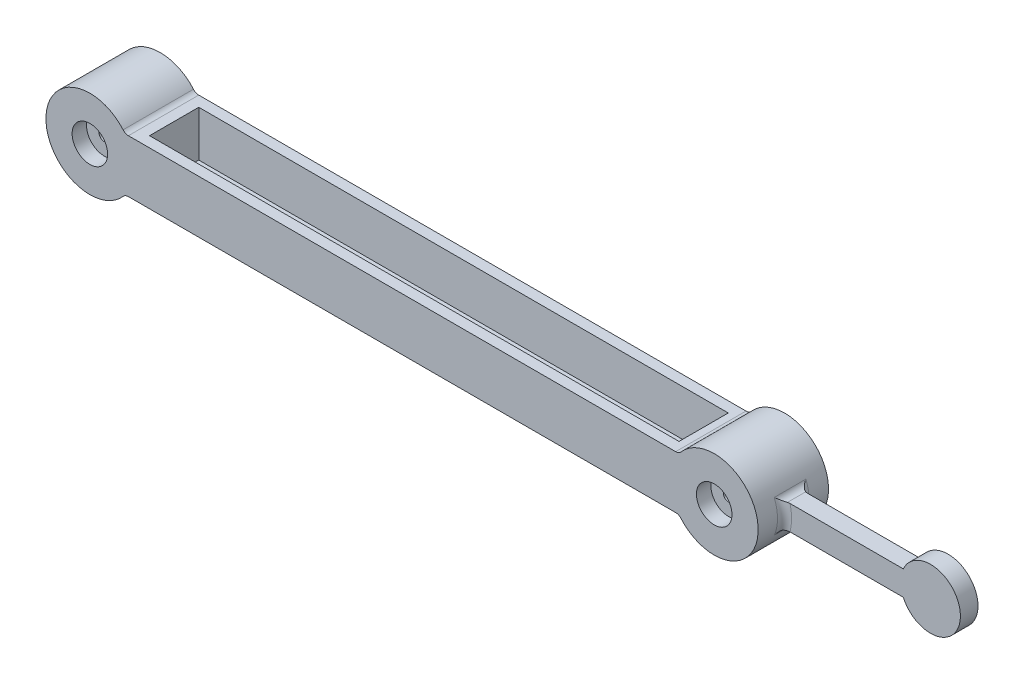
ISO-10303-21;
HEADER;
FILE_DESCRIPTION(('STEP AP214'),'2;1');
FILE_NAME('part.step','',(''),(''),'','','');
FILE_SCHEMA(('AUTOMOTIVE_DESIGN { 1 0 10303 214 1 1 1 1 }'));
ENDSEC;
DATA;
#1=APPLICATION_CONTEXT('core data for automotive mechanical design processes');
#2=APPLICATION_PROTOCOL_DEFINITION('international standard','automotive_design',2000,#1);
#3=PRODUCT_CONTEXT('',#1,'mechanical');
#4=PRODUCT('Part','Part','',(#3));
#5=PRODUCT_RELATED_PRODUCT_CATEGORY('part','',(#4));
#6=PRODUCT_DEFINITION_FORMATION('','',#4);
#7=PRODUCT_DEFINITION_CONTEXT('part definition',#1,'design');
#8=PRODUCT_DEFINITION('design','',#6,#7);
#9=PRODUCT_DEFINITION_SHAPE('','',#8);
#10=(LENGTH_UNIT() NAMED_UNIT(*) SI_UNIT(.MILLI.,.METRE.));
#11=(NAMED_UNIT(*) PLANE_ANGLE_UNIT() SI_UNIT($,.RADIAN.));
#12=(NAMED_UNIT(*) SI_UNIT($,.STERADIAN.) SOLID_ANGLE_UNIT());
#13=UNCERTAINTY_MEASURE_WITH_UNIT(LENGTH_MEASURE(1.E-05),#10,'distance_accuracy_value','');
#14=(GEOMETRIC_REPRESENTATION_CONTEXT(3) GLOBAL_UNCERTAINTY_ASSIGNED_CONTEXT((#13)) GLOBAL_UNIT_ASSIGNED_CONTEXT((#10,
#11,#12)) REPRESENTATION_CONTEXT('',''));
#15=CARTESIAN_POINT('',(0.,0.,0.));
#16=DIRECTION('',(0.,0.,1.));
#17=DIRECTION('',(1.,0.,0.));
#18=AXIS2_PLACEMENT_3D('',#15,#16,#17);
#19=CARTESIAN_POINT('',(200.,-20.001,12.5));
#20=DIRECTION('',(0.,0.,1.));
#21=DIRECTION('',(1.,0.,0.));
#22=AXIS2_PLACEMENT_3D('',#19,#20,#21);
#23=PLANE('',#22);
#24=CARTESIAN_POINT('',(241.5,-7.49999999999998,12.5));
#25=DIRECTION('',(0.,0.,1.));
#26=DIRECTION('',(1.,0.,0.));
#27=AXIS2_PLACEMENT_3D('',#24,#25,#26);
#28=CIRCLE('',#27,8.50000000000001);
#29=CARTESIAN_POINT('',(233.754033307585,-3.99999999999998,12.5));
#30=VERTEX_POINT('',#29);
#31=CARTESIAN_POINT('',(233.754033307585,-11.,12.5));
#32=VERTEX_POINT('',#31);
#33=EDGE_CURVE('E259',#30,#32,#28,.F.);
#34=ORIENTED_EDGE('',*,*,#33,.F.);
#35=DIRECTION('',(1.,0.,0.));
#36=VECTOR('',#35,1.);
#37=CARTESIAN_POINT('',(200.,-3.99999999999998,12.5));
#38=LINE('',#37,#36);
#39=CARTESIAN_POINT('',(201.57124727947,-3.99999999999998,12.5));
#40=VERTEX_POINT('',#39);
#41=EDGE_CURVE('E281',#40,#30,#38,.T.);
#42=ORIENTED_EDGE('',*,*,#41,.F.);
#43=CARTESIAN_POINT('',(187.5,-7.5,12.5));
#44=DIRECTION('',(0.,0.,1.));
#45=DIRECTION('',(1.,0.,0.));
#46=AXIS2_PLACEMENT_3D('',#43,#44,#45);
#47=CIRCLE('',#46,14.5);
#48=CARTESIAN_POINT('',(201.57124727947,-11.,12.5));
#49=VERTEX_POINT('',#48);
#50=EDGE_CURVE('E363',#40,#49,#47,.F.);
#51=ORIENTED_EDGE('',*,*,#50,.T.);
#52=DIRECTION('',(-1.,0.,0.));
#53=VECTOR('',#52,1.);
#54=CARTESIAN_POINT('',(250.,-11.,12.5));
#55=LINE('',#54,#53);
#56=EDGE_CURVE('E278',#32,#49,#55,.T.);
#57=ORIENTED_EDGE('',*,*,#56,.F.);
#58=EDGE_LOOP('',(#34,#42,#51,#57));
#59=FACE_BOUND('',#58,.T.);
#60=ADVANCED_FACE('F58',(#59),#23,.T.);
#61=CARTESIAN_POINT('',(200.,-20.001,7.50000000000001));
#62=DIRECTION('',(0.,0.,-1.));
#63=DIRECTION('',(-1.,0.,0.));
#64=AXIS2_PLACEMENT_3D('',#61,#62,#63);
#65=PLANE('',#64);
#66=DIRECTION('',(-1.,0.,0.));
#67=VECTOR('',#66,1.);
#68=CARTESIAN_POINT('',(200.,-3.99999999999998,7.50000000000001));
#69=LINE('',#68,#67);
#70=CARTESIAN_POINT('',(233.754033307585,-3.99999999999998,7.50000000000001));
#71=VERTEX_POINT('',#70);
#72=CARTESIAN_POINT('',(201.57124727947,-3.99999999999998,7.50000000000001));
#73=VERTEX_POINT('',#72);
#74=EDGE_CURVE('E285',#71,#73,#69,.T.);
#75=ORIENTED_EDGE('',*,*,#74,.F.);
#76=CARTESIAN_POINT('',(241.5,-7.49999999999998,7.50000000000001));
#77=DIRECTION('',(0.,0.,-1.));
#78=DIRECTION('',(-1.,0.,0.));
#79=AXIS2_PLACEMENT_3D('',#76,#77,#78);
#80=CIRCLE('',#79,8.50000000000001);
#81=CARTESIAN_POINT('',(233.754033307585,-11.,7.50000000000001));
#82=VERTEX_POINT('',#81);
#83=EDGE_CURVE('E250',#71,#82,#80,.T.);
#84=ORIENTED_EDGE('',*,*,#83,.T.);
#85=DIRECTION('',(-1.,0.,0.));
#86=VECTOR('',#85,1.);
#87=CARTESIAN_POINT('',(250.,-11.,7.5));
#88=LINE('',#87,#86);
#89=CARTESIAN_POINT('',(201.57124727947,-11.,7.5));
#90=VERTEX_POINT('',#89);
#91=EDGE_CURVE('E274',#82,#90,#88,.T.);
#92=ORIENTED_EDGE('',*,*,#91,.T.);
#93=CARTESIAN_POINT('',(187.5,-7.5,7.50000000000001));
#94=DIRECTION('',(0.,0.,-1.));
#95=DIRECTION('',(-1.,0.,0.));
#96=AXIS2_PLACEMENT_3D('',#93,#94,#95);
#97=CIRCLE('',#96,14.5);
#98=EDGE_CURVE('E343',#90,#73,#97,.F.);
#99=ORIENTED_EDGE('',*,*,#98,.T.);
#100=EDGE_LOOP('',(#75,#84,#92,#99));
#101=FACE_BOUND('',#100,.T.);
#102=ADVANCED_FACE('F514',(#101),#65,.T.);
#103=CARTESIAN_POINT('',(0.,0.,20.));
#104=DIRECTION('',(0.,0.,1.));
#105=DIRECTION('',(1.,0.,0.));
#106=AXIS2_PLACEMENT_3D('',#103,#104,#105);
#107=PLANE('',#106);
#108=CARTESIAN_POINT('',(187.5,-7.5,20.));
#109=DIRECTION('',(0.,0.,1.));
#110=DIRECTION('',(1.,0.,0.));
#111=AXIS2_PLACEMENT_3D('',#108,#109,#110);
#112=CIRCLE('',#111,5.04999999999999);
#113=CARTESIAN_POINT('',(192.55,-7.5,20.));
#114=VERTEX_POINT('',#113);
#115=EDGE_CURVE('E465',#114,#114,#112,.T.);
#116=ORIENTED_EDGE('',*,*,#115,.F.);
#117=EDGE_LOOP('',(#116));
#118=FACE_BOUND('',#117,.T.);
#119=CARTESIAN_POINT('',(10.,-7.5,20.));
#120=DIRECTION('',(0.,0.,1.));
#121=DIRECTION('',(1.,0.,0.));
#122=AXIS2_PLACEMENT_3D('',#119,#120,#121);
#123=CIRCLE('',#122,5.05);
#124=CARTESIAN_POINT('',(15.05,-7.5,20.));
#125=VERTEX_POINT('',#124);
#126=EDGE_CURVE('E231',#125,#125,#123,.T.);
#127=ORIENTED_EDGE('',*,*,#126,.F.);
#128=EDGE_LOOP('',(#127));
#129=FACE_BOUND('',#128,.T.);
#130=DIRECTION('',(1.,0.,0.));
#131=VECTOR('',#130,1.);
#132=CARTESIAN_POINT('',(0.,-15.,20.));
#133=LINE('',#132,#131);
#134=CARTESIAN_POINT('',(20.9544511501033,-15.,20.));
#135=VERTEX_POINT('',#134);
#136=CARTESIAN_POINT('',(176.545548849897,-15.,20.));
#137=VERTEX_POINT('',#136);
#138=EDGE_CURVE('E303',#135,#137,#133,.T.);
#139=ORIENTED_EDGE('',*,*,#138,.T.);
#140=CARTESIAN_POINT('',(176.545548849897,-17.,20.));
#141=DIRECTION('',(0.,0.,1.));
#142=DIRECTION('',(1.,0.,0.));
#143=AXIS2_PLACEMENT_3D('',#140,#141,#142);
#144=CIRCLE('',#143,2.);
#145=CARTESIAN_POINT('',(178.056507629221,-15.6896551724138,20.));
#146=VERTEX_POINT('',#145);
#147=EDGE_CURVE('E68',#137,#146,#144,.F.);
#148=ORIENTED_EDGE('',*,*,#147,.T.);
#149=CARTESIAN_POINT('',(187.5,-7.5,20.));
#150=DIRECTION('',(0.,0.,1.));
#151=DIRECTION('',(1.,0.,0.));
#152=AXIS2_PLACEMENT_3D('',#149,#150,#151);
#153=CIRCLE('',#152,12.5);
#154=CARTESIAN_POINT('',(178.056507629221,0.689655172413798,20.));
#155=VERTEX_POINT('',#154);
#156=EDGE_CURVE('E288',#146,#155,#153,.T.);
#157=ORIENTED_EDGE('',*,*,#156,.T.);
#158=CARTESIAN_POINT('',(176.545548849897,2.,20.));
#159=DIRECTION('',(0.,0.,1.));
#160=DIRECTION('',(1.,0.,0.));
#161=AXIS2_PLACEMENT_3D('',#158,#159,#160);
#162=CIRCLE('',#161,2.);
#163=CARTESIAN_POINT('',(176.545548849897,0.,20.));
#164=VERTEX_POINT('',#163);
#165=EDGE_CURVE('E449',#155,#164,#162,.F.);
#166=ORIENTED_EDGE('',*,*,#165,.T.);
#167=DIRECTION('',(1.,0.,0.));
#168=VECTOR('',#167,1.);
#169=CARTESIAN_POINT('',(0.,0.,20.));
#170=LINE('',#169,#168);
#171=CARTESIAN_POINT('',(20.9544511501033,0.,20.));
#172=VERTEX_POINT('',#171);
#173=EDGE_CURVE('E306',#172,#164,#170,.T.);
#174=ORIENTED_EDGE('',*,*,#173,.F.);
#175=CARTESIAN_POINT('',(20.9544511501033,2.,20.));
#176=DIRECTION('',(0.,0.,1.));
#177=DIRECTION('',(1.,0.,0.));
#178=AXIS2_PLACEMENT_3D('',#175,#176,#177);
#179=CIRCLE('',#178,2.);
#180=CARTESIAN_POINT('',(19.4434923707787,0.689655172413794,20.));
#181=VERTEX_POINT('',#180);
#182=EDGE_CURVE('E340',#172,#181,#179,.F.);
#183=ORIENTED_EDGE('',*,*,#182,.T.);
#184=CARTESIAN_POINT('',(10.,-7.5,20.));
#185=DIRECTION('',(0.,0.,-1.));
#186=DIRECTION('',(-1.,0.,0.));
#187=AXIS2_PLACEMENT_3D('',#184,#185,#186);
#188=CIRCLE('',#187,12.5);
#189=CARTESIAN_POINT('',(19.4434923707787,-15.6896551724138,20.));
#190=VERTEX_POINT('',#189);
#191=EDGE_CURVE('E295',#190,#181,#188,.T.);
#192=ORIENTED_EDGE('',*,*,#191,.F.);
#193=CARTESIAN_POINT('',(20.9544511501033,-17.,20.));
#194=DIRECTION('',(0.,0.,1.));
#195=DIRECTION('',(1.,0.,0.));
#196=AXIS2_PLACEMENT_3D('',#193,#194,#195);
#197=CIRCLE('',#196,2.);
#198=EDGE_CURVE('E327',#190,#135,#197,.F.);
#199=ORIENTED_EDGE('',*,*,#198,.T.);
#200=EDGE_LOOP('',(#139,#148,#157,#166,#174,#183,#192,#199));
#201=FACE_BOUND('',#200,.T.);
#202=ADVANCED_FACE('F511',(#118,#129,#201),#107,.T.);
#203=CARTESIAN_POINT('',(0.,0.,0.));
#204=DIRECTION('',(0.,0.,1.));
#205=DIRECTION('',(1.,0.,0.));
#206=AXIS2_PLACEMENT_3D('',#203,#204,#205);
#207=PLANE('',#206);
#208=CARTESIAN_POINT('',(187.5,-7.5,0.));
#209=DIRECTION('',(0.,0.,-1.));
#210=DIRECTION('',(-1.,0.,0.));
#211=AXIS2_PLACEMENT_3D('',#208,#209,#210);
#212=CIRCLE('',#211,5.05000000000001);
#213=CARTESIAN_POINT('',(182.45,-7.5,0.));
#214=VERTEX_POINT('',#213);
#215=EDGE_CURVE('E485',#214,#214,#212,.T.);
#216=ORIENTED_EDGE('',*,*,#215,.F.);
#217=EDGE_LOOP('',(#216));
#218=FACE_BOUND('',#217,.T.);
#219=CARTESIAN_POINT('',(10.,-7.5,0.));
#220=DIRECTION('',(0.,0.,-1.));
#221=DIRECTION('',(-1.,0.,0.));
#222=AXIS2_PLACEMENT_3D('',#219,#220,#221);
#223=CIRCLE('',#222,5.005);
#224=CARTESIAN_POINT('',(4.995,-7.5,0.));
#225=VERTEX_POINT('',#224);
#226=EDGE_CURVE('E491',#225,#225,#223,.T.);
#227=ORIENTED_EDGE('',*,*,#226,.F.);
#228=EDGE_LOOP('',(#227));
#229=FACE_BOUND('',#228,.T.);
#230=DIRECTION('',(1.,0.,0.));
#231=VECTOR('',#230,1.);
#232=CARTESIAN_POINT('',(0.,0.,0.));
#233=LINE('',#232,#231);
#234=CARTESIAN_POINT('',(20.9544511501033,0.,0.));
#235=VERTEX_POINT('',#234);
#236=CARTESIAN_POINT('',(176.545548849897,0.,0.));
#237=VERTEX_POINT('',#236);
#238=EDGE_CURVE('E307',#235,#237,#233,.T.);
#239=ORIENTED_EDGE('',*,*,#238,.T.);
#240=CARTESIAN_POINT('',(176.545548849897,2.,0.));
#241=DIRECTION('',(0.,0.,1.));
#242=DIRECTION('',(1.,0.,0.));
#243=AXIS2_PLACEMENT_3D('',#240,#241,#242);
#244=CIRCLE('',#243,2.);
#245=CARTESIAN_POINT('',(178.056507629221,0.689655172413798,0.));
#246=VERTEX_POINT('',#245);
#247=EDGE_CURVE('E452',#237,#246,#244,.T.);
#248=ORIENTED_EDGE('',*,*,#247,.T.);
#249=CARTESIAN_POINT('',(187.5,-7.5,0.));
#250=DIRECTION('',(0.,0.,1.));
#251=DIRECTION('',(1.,0.,0.));
#252=AXIS2_PLACEMENT_3D('',#249,#250,#251);
#253=CIRCLE('',#252,12.5);
#254=CARTESIAN_POINT('',(178.056507629221,-15.6896551724138,0.));
#255=VERTEX_POINT('',#254);
#256=EDGE_CURVE('E291',#246,#255,#253,.F.);
#257=ORIENTED_EDGE('',*,*,#256,.T.);
#258=CARTESIAN_POINT('',(176.545548849897,-17.,0.));
#259=DIRECTION('',(0.,0.,1.));
#260=DIRECTION('',(1.,0.,0.));
#261=AXIS2_PLACEMENT_3D('',#258,#259,#260);
#262=CIRCLE('',#261,2.);
#263=CARTESIAN_POINT('',(176.545548849897,-15.,0.));
#264=VERTEX_POINT('',#263);
#265=EDGE_CURVE('E13',#255,#264,#262,.T.);
#266=ORIENTED_EDGE('',*,*,#265,.T.);
#267=DIRECTION('',(1.,0.,0.));
#268=VECTOR('',#267,1.);
#269=CARTESIAN_POINT('',(0.,-15.,0.));
#270=LINE('',#269,#268);
#271=CARTESIAN_POINT('',(20.9544511501033,-15.,0.));
#272=VERTEX_POINT('',#271);
#273=EDGE_CURVE('E299',#272,#264,#270,.T.);
#274=ORIENTED_EDGE('',*,*,#273,.F.);
#275=CARTESIAN_POINT('',(20.9544511501033,-17.,0.));
#276=DIRECTION('',(0.,0.,1.));
#277=DIRECTION('',(1.,0.,0.));
#278=AXIS2_PLACEMENT_3D('',#275,#276,#277);
#279=CIRCLE('',#278,2.);
#280=CARTESIAN_POINT('',(19.4434923707787,-15.6896551724138,0.));
#281=VERTEX_POINT('',#280);
#282=EDGE_CURVE('E324',#272,#281,#279,.T.);
#283=ORIENTED_EDGE('',*,*,#282,.T.);
#284=CARTESIAN_POINT('',(10.,-7.5,0.));
#285=DIRECTION('',(0.,0.,-1.));
#286=DIRECTION('',(-1.,0.,0.));
#287=AXIS2_PLACEMENT_3D('',#284,#285,#286);
#288=CIRCLE('',#287,12.5);
#289=CARTESIAN_POINT('',(19.4434923707787,0.689655172413794,0.));
#290=VERTEX_POINT('',#289);
#291=EDGE_CURVE('E294',#281,#290,#288,.T.);
#292=ORIENTED_EDGE('',*,*,#291,.T.);
#293=CARTESIAN_POINT('',(20.9544511501033,2.,0.));
#294=DIRECTION('',(0.,0.,1.));
#295=DIRECTION('',(1.,0.,0.));
#296=AXIS2_PLACEMENT_3D('',#293,#294,#295);
#297=CIRCLE('',#296,2.);
#298=EDGE_CURVE('E337',#290,#235,#297,.T.);
#299=ORIENTED_EDGE('',*,*,#298,.T.);
#300=EDGE_LOOP('',(#239,#248,#257,#266,#274,#283,#292,#299));
#301=FACE_BOUND('',#300,.T.);
#302=ADVANCED_FACE('F513',(#218,#229,#301),#207,.F.);
#303=CARTESIAN_POINT('',(0.,-15.,20.));
#304=DIRECTION('',(0.,1.,0.));
#305=DIRECTION('',(0.,0.,1.));
#306=AXIS2_PLACEMENT_3D('',#303,#304,#305);
#307=PLANE('',#306);
#308=ORIENTED_EDGE('',*,*,#273,.T.);
#309=DIRECTION('',(0.,0.,1.));
#310=VECTOR('',#309,1.);
#311=CARTESIAN_POINT('',(176.545548849897,-15.,20.));
#312=LINE('',#311,#310);
#313=EDGE_CURVE('E455',#264,#137,#312,.T.);
#314=ORIENTED_EDGE('',*,*,#313,.T.);
#315=ORIENTED_EDGE('',*,*,#138,.F.);
#316=DIRECTION('',(0.,0.,-1.));
#317=VECTOR('',#316,1.);
#318=CARTESIAN_POINT('',(20.9544511501033,-15.,20.));
#319=LINE('',#318,#317);
#320=EDGE_CURVE('E311',#135,#272,#319,.T.);
#321=ORIENTED_EDGE('',*,*,#320,.T.);
#322=EDGE_LOOP('',(#308,#314,#315,#321));
#323=FACE_BOUND('',#322,.T.);
#324=ADVANCED_FACE('F522',(#323),#307,.F.);
#325=CARTESIAN_POINT('',(0.,0.,20.));
#326=DIRECTION('',(0.,1.,0.));
#327=DIRECTION('',(0.,0.,1.));
#328=AXIS2_PLACEMENT_3D('',#325,#326,#327);
#329=PLANE('',#328);
#330=DIRECTION('',(0.,0.,1.));
#331=VECTOR('',#330,1.);
#332=CARTESIAN_POINT('',(23.9544511501033,0.,3.));
#333=LINE('',#332,#331);
#334=CARTESIAN_POINT('',(23.9544511501033,0.,3.));
#335=VERTEX_POINT('',#334);
#336=CARTESIAN_POINT('',(23.9544511501033,0.,17.));
#337=VERTEX_POINT('',#336);
#338=EDGE_CURVE('E204',#335,#337,#333,.T.);
#339=ORIENTED_EDGE('',*,*,#338,.F.);
#340=DIRECTION('',(-1.,0.,0.));
#341=VECTOR('',#340,1.);
#342=CARTESIAN_POINT('',(23.9544511501033,0.,3.));
#343=LINE('',#342,#341);
#344=CARTESIAN_POINT('',(174.5,0.,3.));
#345=VERTEX_POINT('',#344);
#346=EDGE_CURVE('E224',#345,#335,#343,.T.);
#347=ORIENTED_EDGE('',*,*,#346,.F.);
#348=DIRECTION('',(0.,0.,-1.));
#349=VECTOR('',#348,1.);
#350=CARTESIAN_POINT('',(174.5,0.,3.));
#351=LINE('',#350,#349);
#352=CARTESIAN_POINT('',(174.5,0.,17.));
#353=VERTEX_POINT('',#352);
#354=EDGE_CURVE('E228',#353,#345,#351,.T.);
#355=ORIENTED_EDGE('',*,*,#354,.F.);
#356=DIRECTION('',(1.,0.,0.));
#357=VECTOR('',#356,1.);
#358=CARTESIAN_POINT('',(23.9544511501033,0.,17.));
#359=LINE('',#358,#357);
#360=EDGE_CURVE('E240',#337,#353,#359,.T.);
#361=ORIENTED_EDGE('',*,*,#360,.F.);
#362=EDGE_LOOP('',(#339,#347,#355,#361));
#363=FACE_BOUND('',#362,.T.);
#364=ORIENTED_EDGE('',*,*,#173,.T.);
#365=DIRECTION('',(0.,0.,-1.));
#366=VECTOR('',#365,1.);
#367=CARTESIAN_POINT('',(176.545548849897,0.,0.));
#368=LINE('',#367,#366);
#369=EDGE_CURVE('E446',#164,#237,#368,.T.);
#370=ORIENTED_EDGE('',*,*,#369,.T.);
#371=ORIENTED_EDGE('',*,*,#238,.F.);
#372=DIRECTION('',(0.,0.,1.));
#373=VECTOR('',#372,1.);
#374=CARTESIAN_POINT('',(20.9544511501033,0.,20.));
#375=LINE('',#374,#373);
#376=EDGE_CURVE('E334',#235,#172,#375,.T.);
#377=ORIENTED_EDGE('',*,*,#376,.T.);
#378=EDGE_LOOP('',(#364,#370,#371,#377));
#379=FACE_BOUND('',#378,.T.);
#380=ADVANCED_FACE('F540',(#363,#379),#329,.T.);
#381=CARTESIAN_POINT('',(10.,-7.5,20.));
#382=DIRECTION('',(0.,0.,-1.));
#383=DIRECTION('',(-1.,0.,0.));
#384=AXIS2_PLACEMENT_3D('',#381,#382,#383);
#385=CYLINDRICAL_SURFACE('',#384,12.5);
#386=ORIENTED_EDGE('',*,*,#191,.T.);
#387=DIRECTION('',(0.,0.,-1.));
#388=VECTOR('',#387,1.);
#389=CARTESIAN_POINT('',(19.4434923707787,0.689655172413792,20.));
#390=LINE('',#389,#388);
#391=EDGE_CURVE('E330',#181,#290,#390,.T.);
#392=ORIENTED_EDGE('',*,*,#391,.T.);
#393=ORIENTED_EDGE('',*,*,#291,.F.);
#394=DIRECTION('',(0.,0.,-1.));
#395=VECTOR('',#394,1.);
#396=CARTESIAN_POINT('',(19.4434923707787,-15.6896551724138,20.));
#397=LINE('',#396,#395);
#398=EDGE_CURVE('E321',#281,#190,#397,.F.);
#399=ORIENTED_EDGE('',*,*,#398,.T.);
#400=EDGE_LOOP('',(#386,#392,#393,#399));
#401=FACE_BOUND('',#400,.T.);
#402=ADVANCED_FACE('F531',(#401),#385,.T.);
#403=CARTESIAN_POINT('',(20.9544511501033,-17.,20.));
#404=DIRECTION('',(0.,0.,-1.));
#405=DIRECTION('',(-1.,0.,0.));
#406=AXIS2_PLACEMENT_3D('',#403,#404,#405);
#407=CYLINDRICAL_SURFACE('',#406,2.);
#408=ORIENTED_EDGE('',*,*,#198,.F.);
#409=ORIENTED_EDGE('',*,*,#398,.F.);
#410=ORIENTED_EDGE('',*,*,#282,.F.);
#411=ORIENTED_EDGE('',*,*,#320,.F.);
#412=EDGE_LOOP('',(#408,#409,#410,#411));
#413=FACE_BOUND('',#412,.T.);
#414=ADVANCED_FACE('F526',(#413),#407,.F.);
#415=CARTESIAN_POINT('',(20.9544511501033,2.,20.));
#416=DIRECTION('',(0.,0.,-1.));
#417=DIRECTION('',(-1.,0.,0.));
#418=AXIS2_PLACEMENT_3D('',#415,#416,#417);
#419=CYLINDRICAL_SURFACE('',#418,2.);
#420=ORIENTED_EDGE('',*,*,#182,.F.);
#421=ORIENTED_EDGE('',*,*,#376,.F.);
#422=ORIENTED_EDGE('',*,*,#298,.F.);
#423=ORIENTED_EDGE('',*,*,#391,.F.);
#424=EDGE_LOOP('',(#420,#421,#422,#423));
#425=FACE_BOUND('',#424,.T.);
#426=ADVANCED_FACE('F535',(#425),#419,.F.);
#427=CARTESIAN_POINT('',(187.5,-7.5,-35.3553390593273));
#428=DIRECTION('',(0.,0.,1.));
#429=DIRECTION('',(1.,0.,0.));
#430=AXIS2_PLACEMENT_3D('',#427,#428,#429);
#431=CYLINDRICAL_SURFACE('',#430,12.5);
#432=DIRECTION('',(0.,0.,1.));
#433=VECTOR('',#432,1.);
#434=CARTESIAN_POINT('',(199.065868849137,-2.75862068965515,-35.3553390593273));
#435=LINE('',#434,#433);
#436=CARTESIAN_POINT('',(199.065868849137,-2.75862068965515,14.5));
#437=VERTEX_POINT('',#436);
#438=CARTESIAN_POINT('',(199.065868849137,-2.75862068965515,5.5));
#439=VERTEX_POINT('',#438);
#440=EDGE_CURVE('E353',#437,#439,#435,.F.);
#441=ORIENTED_EDGE('',*,*,#440,.T.);
#442=CARTESIAN_POINT('',(187.5,-7.5,5.50000000000001));
#443=DIRECTION('',(0.,0.,-1.));
#444=DIRECTION('',(-1.,0.,0.));
#445=AXIS2_PLACEMENT_3D('',#442,#443,#444);
#446=CIRCLE('',#445,12.5);
#447=CARTESIAN_POINT('',(199.163765639202,-11.99517197822,5.49999999999999));
#448=VERTEX_POINT('',#447);
#449=EDGE_CURVE('E356',#439,#448,#446,.T.);
#450=ORIENTED_EDGE('',*,*,#449,.T.);
#451=DIRECTION('',(0.,0.,1.));
#452=VECTOR('',#451,1.);
#453=CARTESIAN_POINT('',(199.163765639202,-11.99517197822,-35.3553390593273));
#454=LINE('',#453,#452);
#455=CARTESIAN_POINT('',(199.163765639202,-11.99517197822,14.5));
#456=VERTEX_POINT('',#455);
#457=EDGE_CURVE('E347',#448,#456,#454,.T.);
#458=ORIENTED_EDGE('',*,*,#457,.T.);
#459=CARTESIAN_POINT('',(187.5,-7.5,14.5));
#460=DIRECTION('',(0.,0.,1.));
#461=DIRECTION('',(1.,0.,0.));
#462=AXIS2_PLACEMENT_3D('',#459,#460,#461);
#463=CIRCLE('',#462,12.5);
#464=EDGE_CURVE('E350',#456,#437,#463,.T.);
#465=ORIENTED_EDGE('',*,*,#464,.T.);
#466=EDGE_LOOP('',(#441,#450,#458,#465));
#467=FACE_BOUND('',#466,.T.);
#468=ORIENTED_EDGE('',*,*,#156,.F.);
#469=DIRECTION('',(0.,0.,1.));
#470=VECTOR('',#469,1.);
#471=CARTESIAN_POINT('',(178.056507629221,-15.6896551724138,-35.3553390593273));
#472=LINE('',#471,#470);
#473=EDGE_CURVE('E82',#146,#255,#472,.F.);
#474=ORIENTED_EDGE('',*,*,#473,.T.);
#475=ORIENTED_EDGE('',*,*,#256,.F.);
#476=DIRECTION('',(0.,0.,1.));
#477=VECTOR('',#476,1.);
#478=CARTESIAN_POINT('',(178.056507629221,0.689655172413793,-35.3553390593273));
#479=LINE('',#478,#477);
#480=EDGE_CURVE('E408',#246,#155,#479,.T.);
#481=ORIENTED_EDGE('',*,*,#480,.T.);
#482=EDGE_LOOP('',(#468,#474,#475,#481));
#483=FACE_BOUND('',#482,.T.);
#484=ADVANCED_FACE('F393',(#467,#483),#431,.T.);
#485=CARTESIAN_POINT('',(0.,-3.99999999999998,0.));
#486=DIRECTION('',(0.,1.,0.));
#487=DIRECTION('',(0.,0.,1.));
#488=AXIS2_PLACEMENT_3D('',#485,#486,#487);
#489=PLANE('',#488);
#490=DIRECTION('',(0.,0.,-1.));
#491=VECTOR('',#490,1.);
#492=CARTESIAN_POINT('',(233.754033307585,-3.99999999999998,36.5416305603426));
#493=LINE('',#492,#491);
#494=EDGE_CURVE('E266',#71,#30,#493,.F.);
#495=ORIENTED_EDGE('',*,*,#494,.F.);
#496=ORIENTED_EDGE('',*,*,#74,.T.);
#497=CARTESIAN_POINT('',(201.57124727947,-3.99999999999998,7.50000000000001));
#498=CARTESIAN_POINT('',(201.515605478267,-3.99999999999998,7.50000359986055));
#499=CARTESIAN_POINT('',(201.459964742336,-3.99999999999998,7.49781329007921));
#500=CARTESIAN_POINT('',(201.349363147591,-3.99999999999998,7.48910786881818));
#501=CARTESIAN_POINT('',(201.294400211957,-3.99999999999998,7.48261913950181));
#502=CARTESIAN_POINT('',(201.185147898397,-3.99999999999998,7.46537904372189));
#503=CARTESIAN_POINT('',(201.130858508989,-3.99999999999998,7.45462775002152));
#504=CARTESIAN_POINT('',(201.022952882588,-3.99999999999998,7.42885085870193));
#505=CARTESIAN_POINT('',(200.969342796758,-3.99999999999998,7.41379951092649));
#506=CARTESIAN_POINT('',(200.916407864999,-3.99999999999998,7.39665866512649));
#507=B_SPLINE_CURVE_WITH_KNOTS('',3,(#497,#498,#499,#500,#501,#502,#503,#504,#505,#506),
.UNSPECIFIED.,.F.,.F.,(4,2,2,2,4),(0.,0.166880700383961,0.332746520621892,0.498609509604915,
0.665487343841117),.UNSPECIFIED.);
#508=CARTESIAN_POINT('',(200.916407864999,-3.99999999999998,7.39665866512649));
#509=VERTEX_POINT('',#508);
#510=EDGE_CURVE('E367',#73,#509,#507,.T.);
#511=ORIENTED_EDGE('',*,*,#510,.T.);
#512=DIRECTION('',(0.,0.,-1.));
#513=VECTOR('',#512,1.);
#514=CARTESIAN_POINT('',(200.916407864999,-3.99999999999998,12.5));
#515=LINE('',#514,#513);
#516=CARTESIAN_POINT('',(200.916407864999,-3.99999999999998,12.6033413348735));
#517=VERTEX_POINT('',#516);
#518=EDGE_CURVE('E360',#509,#517,#515,.F.);
#519=ORIENTED_EDGE('',*,*,#518,.T.);
#520=CARTESIAN_POINT('',(200.916407864999,-3.99999999999998,12.6033413348735));
#521=CARTESIAN_POINT('',(200.969342796758,-3.99999999999998,12.5862004890735));
#522=CARTESIAN_POINT('',(201.022952882588,-3.99999999999998,12.5711491412981));
#523=CARTESIAN_POINT('',(201.130858508989,-3.99999999999998,12.5453722499785));
#524=CARTESIAN_POINT('',(201.185147898397,-3.99999999999998,12.5346209562781));
#525=CARTESIAN_POINT('',(201.294400211957,-3.99999999999998,12.5173808604982));
#526=CARTESIAN_POINT('',(201.349363147591,-3.99999999999998,12.5108921311818));
#527=CARTESIAN_POINT('',(201.459964742336,-3.99999999999998,12.5021867099208));
#528=CARTESIAN_POINT('',(201.515605478267,-3.99999999999998,12.4999964001395));
#529=CARTESIAN_POINT('',(201.57124727947,-3.99999999999998,12.5));
#530=B_SPLINE_CURVE_WITH_KNOTS('',3,(#520,#521,#522,#523,#524,#525,#526,#527,#528,#529),
.UNSPECIFIED.,.F.,.F.,(4,2,2,2,4),(0.,0.166877834236202,0.332740823219225,0.498606643457156,
0.665487343841117),.UNSPECIFIED.);
#531=EDGE_CURVE('E400',#517,#40,#530,.T.);
#532=ORIENTED_EDGE('',*,*,#531,.T.);
#533=ORIENTED_EDGE('',*,*,#41,.T.);
#534=EDGE_LOOP('',(#495,#496,#511,#519,#532,#533));
#535=FACE_BOUND('',#534,.T.);
#536=ADVANCED_FACE('F388',(#535),#489,.T.);
#537=CARTESIAN_POINT('',(250.,-11.,12.5));
#538=DIRECTION('',(0.,1.,0.));
#539=DIRECTION('',(-1.,0.,0.));
#540=AXIS2_PLACEMENT_3D('',#537,#538,#539);
#541=PLANE('',#540);
#542=ORIENTED_EDGE('',*,*,#91,.F.);
#543=DIRECTION('',(0.,0.,-1.));
#544=VECTOR('',#543,1.);
#545=CARTESIAN_POINT('',(233.754033307585,-11.,36.5416305603426));
#546=LINE('',#545,#544);
#547=EDGE_CURVE('E262',#82,#32,#546,.F.);
#548=ORIENTED_EDGE('',*,*,#547,.T.);
#549=ORIENTED_EDGE('',*,*,#56,.T.);
#550=CARTESIAN_POINT('',(201.57124727947,-11.,12.5));
#551=CARTESIAN_POINT('',(201.51162382029,-11.,12.5000016456297));
#552=CARTESIAN_POINT('',(201.452029989283,-11.,12.5025124577496));
#553=CARTESIAN_POINT('',(201.333262944996,-11.,12.512524431705));
#554=CARTESIAN_POINT('',(201.274089732418,-11.,12.5200256018678));
#555=CARTESIAN_POINT('',(201.097716265368,-11.,12.5499772638655));
#556=CARTESIAN_POINT('',(200.981690002942,-11.,12.5798758811724));
#557=CARTESIAN_POINT('',(200.756284563965,-11.,12.6587515729556));
#558=CARTESIAN_POINT('',(200.646910918206,-11.,12.7077442776903));
#559=CARTESIAN_POINT('',(200.438199834693,-11.,12.8235375981562));
#560=CARTESIAN_POINT('',(200.338843041622,-11.,12.8903029263211));
#561=CARTESIAN_POINT('',(200.201873349749,-11.,13.0006149997572));
#562=CARTESIAN_POINT('',(200.159179790318,-11.,13.0380047874333));
#563=CARTESIAN_POINT('',(200.077075730124,-11.,13.1161558099637));
#564=CARTESIAN_POINT('',(200.037662195178,-11.,13.1569138578436));
#565=CARTESIAN_POINT('',(200.,-11.,13.1992715169306));
#566=B_SPLINE_CURVE_WITH_KNOTS('',3,(#550,#551,#552,#553,#554,#555,#556,#557,#558,#559,#560,
#561,#562,#563,#564,#565),.UNSPECIFIED.,.F.,.F.,(4,2,2,2,2,2,2,4),(0.,0.178758942197527,
0.357518182685035,0.71511907625985,1.07301331583531,1.43020218871193,1.60029028662042,
1.77021925408653),.UNSPECIFIED.);
#567=CARTESIAN_POINT('',(200.,-11.,13.1992715169306));
#568=VERTEX_POINT('',#567);
#569=EDGE_CURVE('E409',#49,#568,#566,.T.);
#570=ORIENTED_EDGE('',*,*,#569,.T.);
#571=DIRECTION('',(0.,0.,-1.));
#572=VECTOR('',#571,1.);
#573=CARTESIAN_POINT('',(200.,-11.,12.5));
#574=LINE('',#573,#572);
#575=CARTESIAN_POINT('',(200.,-11.,6.80072848306937));
#576=VERTEX_POINT('',#575);
#577=EDGE_CURVE('E271',#568,#576,#574,.T.);
#578=ORIENTED_EDGE('',*,*,#577,.T.);
#579=CARTESIAN_POINT('',(200.,-11.,6.80072848306937));
#580=CARTESIAN_POINT('',(200.038907567059,-11.,6.8444878824641));
#581=CARTESIAN_POINT('',(200.079686314274,-11.,6.88654030735841));
#582=CARTESIAN_POINT('',(200.164681235809,-11.,6.96699896735284));
#583=CARTESIAN_POINT('',(200.20889677045,-11.,7.00540587804037));
#584=CARTESIAN_POINT('',(200.346113701294,-11.,7.11471376628746));
#585=CARTESIAN_POINT('',(200.443815182844,-11.,7.17984707714963));
#586=CARTESIAN_POINT('',(200.648600179143,-11.,7.29291300846766));
#587=CARTESIAN_POINT('',(200.755682808273,-11.,7.34084725041487));
#588=CARTESIAN_POINT('',(200.976233676181,-11.,7.41839971965647));
#589=CARTESIAN_POINT('',(201.089695563287,-11.,7.44803582555481));
#590=CARTESIAN_POINT('',(201.26525542627,-11.,7.47876188612817));
#591=CARTESIAN_POINT('',(201.326228447063,-11.,7.48672402431916));
#592=CARTESIAN_POINT('',(201.44854082522,-11.,7.49733857987544));
#593=CARTESIAN_POINT('',(201.509879478549,-11.,7.49999911019276));
#594=CARTESIAN_POINT('',(201.57124727947,-11.,7.50000000000001));
#595=B_SPLINE_CURVE_WITH_KNOTS('',3,(#579,#580,#581,#582,#583,#584,#585,#586,#587,#588,#589,
#590,#591,#592,#593,#594),.UNSPECIFIED.,.F.,.F.,(4,2,2,2,2,2,2,4),(0.,0.17554815106669,
0.351063705737492,0.701518241773535,1.05193972902048,1.4020182850192,1.58628873669285,
1.7702769855007),.UNSPECIFIED.);
#596=EDGE_CURVE('E377',#576,#90,#595,.T.);
#597=ORIENTED_EDGE('',*,*,#596,.T.);
#598=EDGE_LOOP('',(#542,#548,#549,#570,#578,#597));
#599=FACE_BOUND('',#598,.T.);
#600=ADVANCED_FACE('F392',(#599),#541,.F.);
#601=CARTESIAN_POINT('',(187.5,-7.5,14.5));
#602=DIRECTION('',(0.,0.,1.));
#603=DIRECTION('',(1.,0.,0.));
#604=AXIS2_PLACEMENT_3D('',#601,#602,#603);
#605=TOROIDAL_SURFACE('',#604,14.5,2.);
#606=CARTESIAN_POINT('',(200.916407864999,-3.99999999999998,12.6033413348735));
#607=CARTESIAN_POINT('',(200.862186883756,-4.00000390121646,12.6208885368897));
#608=CARTESIAN_POINT('',(200.808686295791,-3.99779540526467,12.6404426257832));
#609=CARTESIAN_POINT('',(200.70356489637,-3.98933870418249,12.6830845423605));
#610=CARTESIAN_POINT('',(200.65194037839,-3.98309897978155,12.706164874032));
#611=CARTESIAN_POINT('',(200.501501436883,-3.95910078698158,12.7794680464116));
#612=CARTESIAN_POINT('',(200.405713142822,-3.93604270785565,12.8342272080231));
#613=CARTESIAN_POINT('',(200.198325531016,-3.87064017908624,12.9691740155557));
#614=CARTESIAN_POINT('',(200.089764238342,-3.82471088380596,13.052194646803));
#615=CARTESIAN_POINT('',(199.887718282399,-3.71897918702722,13.2283264972153));
#616=CARTESIAN_POINT('',(199.794337086407,-3.6590878406703,13.3215002794785));
#617=CARTESIAN_POINT('',(199.646745537588,-3.54723945128378,13.4870041689755));
#618=CARTESIAN_POINT('',(199.588896160285,-3.49777131748866,13.557847277867));
#619=CARTESIAN_POINT('',(199.480590914056,-3.39428932207958,13.7018938331797));
#620=CARTESIAN_POINT('',(199.4301387045,-3.34027323125873,13.7750984261238));
#621=CARTESIAN_POINT('',(199.336496491789,-3.22848852541345,13.9229197508665));
#622=CARTESIAN_POINT('',(199.293290736994,-3.1707284381349,13.9975330169747));
#623=CARTESIAN_POINT('',(199.213834572629,-3.05183387339349,14.1476960071141));
#624=CARTESIAN_POINT('',(199.177581233542,-2.99070083122592,14.2232453223759));
#625=CARTESIAN_POINT('',(199.116726557607,-2.87452540064189,14.3637212272183));
#626=CARTESIAN_POINT('',(199.091196791537,-2.81989703297147,14.4285881852315));
#627=CARTESIAN_POINT('',(199.067410641857,-2.76237351327038,14.4956302715592));
#628=CARTESIAN_POINT('',(199.066638315924,-2.76049767869423,14.4978151445727));
#629=CARTESIAN_POINT('',(199.065868849137,-2.75862068965516,14.5));
#630=B_SPLINE_CURVE_WITH_KNOTS('',3,(#606,#607,#608,#609,#610,#611,#612,#613,#614,#615,#616,
#617,#618,#619,#620,#621,#622,#623,#624,#625,#626,#627,#628,#629),.UNSPECIFIED.,.F.,.F.,(4,2,2,
2,2,2,2,2,2,2,2,4),(0.,0.170778533186009,0.341198954432175,0.677654053997893,1.10791791783455,
1.54100151735702,1.85256779378011,2.16428768528113,2.47532095287399,2.78622287206828,
3.05172929734904,3.0606735740518),.UNSPECIFIED.);
#631=EDGE_CURVE('E429',#437,#517,#630,.F.);
#632=ORIENTED_EDGE('',*,*,#631,.F.);
#633=ORIENTED_EDGE('',*,*,#464,.F.);
#634=CARTESIAN_POINT('',(200.,-11.,13.1992715169306));
#635=CARTESIAN_POINT('',(199.943224365213,-11.034134871955,13.252410015321));
#636=CARTESIAN_POINT('',(199.889211473703,-11.0703976826139,13.3070355765156));
#637=CARTESIAN_POINT('',(199.786567134142,-11.146580617138,13.4186149677985));
#638=CARTESIAN_POINT('',(199.737929970857,-11.186496772734,13.4755662353077));
#639=CARTESIAN_POINT('',(199.645897958607,-11.2693501253518,13.5911096573184));
#640=CARTESIAN_POINT('',(199.602489142727,-11.3122787657981,13.6496969007307));
#641=CARTESIAN_POINT('',(199.520574456136,-11.4008658204407,13.7682284908815));
#642=CARTESIAN_POINT('',(199.482069685073,-11.4465248435173,13.8281731384581));
#643=CARTESIAN_POINT('',(199.386684734066,-11.5702623028953,13.9877356980767));
#644=CARTESIAN_POINT('',(199.333819766843,-11.6503839271457,14.0881864719828));
#645=CARTESIAN_POINT('',(199.240553602801,-11.816056483818,14.290256993324));
#646=CARTESIAN_POINT('',(199.200143673653,-11.901603561438,14.391875869705));
#647=CARTESIAN_POINT('',(199.165227543339,-11.9913873307303,14.4956302832869));
#648=CARTESIAN_POINT('',(199.164495149946,-11.9932791136459,14.4978151563906));
#649=CARTESIAN_POINT('',(199.163765639202,-11.99517197822,14.5));
#650=B_SPLINE_CURVE_WITH_KNOTS('',3,(#634,#635,#636,#637,#638,#639,#640,#641,#642,#643,#644,
#645,#646,#647,#648,#649),.UNSPECIFIED.,.F.,.F.,(4,2,2,2,2,2,2,4),(0.,0.254603188791481,
0.508933036922161,0.762567650512276,1.01625903755188,1.43234508102664,1.84813873604255,
1.85708301274525),.UNSPECIFIED.);
#651=EDGE_CURVE('E275',#568,#456,#650,.T.);
#652=ORIENTED_EDGE('',*,*,#651,.F.);
#653=ORIENTED_EDGE('',*,*,#569,.F.);
#654=ORIENTED_EDGE('',*,*,#50,.F.);
#655=ORIENTED_EDGE('',*,*,#531,.F.);
#656=EDGE_LOOP('',(#632,#633,#652,#653,#654,#655));
#657=FACE_BOUND('',#656,.T.);
#658=ADVANCED_FACE('F419',(#657),#605,.F.);
#659=CARTESIAN_POINT('',(201.029968141474,-12.7143994947352,-35.3553390593273));
#660=DIRECTION('',(0.,0.,1.));
#661=DIRECTION('',(1.,0.,0.));
#662=AXIS2_PLACEMENT_3D('',#659,#660,#661);
#663=CYLINDRICAL_SURFACE('',#662,2.);
#664=ORIENTED_EDGE('',*,*,#651,.T.);
#665=ORIENTED_EDGE('',*,*,#457,.F.);
#666=CARTESIAN_POINT('',(200.,-11.,6.80072848306937));
#667=CARTESIAN_POINT('',(199.943224365213,-11.034134871955,6.74758998467903));
#668=CARTESIAN_POINT('',(199.889211473703,-11.0703976826139,6.69296442348444));
#669=CARTESIAN_POINT('',(199.786567134142,-11.146580617138,6.58138503220149));
#670=CARTESIAN_POINT('',(199.737929970857,-11.186496772734,6.52443376469226));
#671=CARTESIAN_POINT('',(199.645897958607,-11.2693501253518,6.40889034268157));
#672=CARTESIAN_POINT('',(199.602489142727,-11.3122787657981,6.35030309926931));
#673=CARTESIAN_POINT('',(199.520574456137,-11.4008658204407,6.23177150911847));
#674=CARTESIAN_POINT('',(199.482069685073,-11.4465248435174,6.17182686154201));
#675=CARTESIAN_POINT('',(199.386684734066,-11.5702623028952,6.01226430192324));
#676=CARTESIAN_POINT('',(199.333819766843,-11.6503839271453,5.91181352801679));
#677=CARTESIAN_POINT('',(199.240553602801,-11.8160564838184,5.70974300667643));
#678=CARTESIAN_POINT('',(199.200143673653,-11.9016035614397,5.60812413029664));
#679=CARTESIAN_POINT('',(199.165227543339,-11.9913873307304,5.50436971671313));
#680=CARTESIAN_POINT('',(199.164495149946,-11.9932791136459,5.50218484360941));
#681=CARTESIAN_POINT('',(199.163765639202,-11.99517197822,5.50000000000001));
#682=B_SPLINE_CURVE_WITH_KNOTS('',3,(#666,#667,#668,#669,#670,#671,#672,#673,#674,#675,#676,
#677,#678,#679,#680,#681),.UNSPECIFIED.,.F.,.F.,(4,2,2,2,2,2,2,4),(0.,0.254603188791493,
0.508933036922163,0.762567650512251,1.01625903755188,1.43234508102663,1.84813873604254,
1.85708301274525),.UNSPECIFIED.);
#683=EDGE_CURVE('E593',#576,#448,#682,.T.);
#684=ORIENTED_EDGE('',*,*,#683,.F.);
#685=ORIENTED_EDGE('',*,*,#577,.F.);
#686=EDGE_LOOP('',(#664,#665,#684,#685));
#687=FACE_BOUND('',#686,.T.);
#688=ADVANCED_FACE('F422',(#687),#663,.F.);
#689=CARTESIAN_POINT('',(200.916407864999,-1.99999999999998,-35.3553390593273));
#690=DIRECTION('',(0.,0.,1.));
#691=DIRECTION('',(1.,0.,0.));
#692=AXIS2_PLACEMENT_3D('',#689,#690,#691);
#693=CYLINDRICAL_SURFACE('',#692,2.);
#694=ORIENTED_EDGE('',*,*,#518,.F.);
#695=CARTESIAN_POINT('',(200.916407864999,-3.99999999999998,7.39665866512649));
#696=CARTESIAN_POINT('',(200.862186883756,-4.00000390121646,7.37911146311029));
#697=CARTESIAN_POINT('',(200.808686295791,-3.99779540526467,7.35955737421677));
#698=CARTESIAN_POINT('',(200.70356489637,-3.98933870418249,7.3169154576395));
#699=CARTESIAN_POINT('',(200.65194037839,-3.98309897978155,7.29383512596795));
#700=CARTESIAN_POINT('',(200.501501436883,-3.95910078698158,7.22053195358838));
#701=CARTESIAN_POINT('',(200.405713142822,-3.93604270785565,7.16577279197689));
#702=CARTESIAN_POINT('',(200.198325531016,-3.87064017908624,7.03082598444431));
#703=CARTESIAN_POINT('',(200.089764238342,-3.82471088380596,6.94780535319697));
#704=CARTESIAN_POINT('',(199.887718282399,-3.71897918702721,6.77167350278467));
#705=CARTESIAN_POINT('',(199.794337086407,-3.65908784067029,6.67849972052152));
#706=CARTESIAN_POINT('',(199.646745537588,-3.54723945128378,6.51299583102451));
#707=CARTESIAN_POINT('',(199.588896160285,-3.49777131748868,6.44215272213299));
#708=CARTESIAN_POINT('',(199.480590914056,-3.39428932207954,6.29810616682033));
#709=CARTESIAN_POINT('',(199.4301387045,-3.34027323125863,6.22490157387627));
#710=CARTESIAN_POINT('',(199.336496491789,-3.22848852541351,6.0770802491334));
#711=CARTESIAN_POINT('',(199.293290736994,-3.1707284381352,6.00246698302495));
#712=CARTESIAN_POINT('',(199.213834572629,-3.05183387339317,5.85230399288618));
#713=CARTESIAN_POINT('',(199.177581233541,-2.99070083122474,5.77675467762531));
#714=CARTESIAN_POINT('',(199.116726557607,-2.8745254006429,5.63627877278071));
#715=CARTESIAN_POINT('',(199.091196791539,-2.81989703297497,5.57141181476503));
#716=CARTESIAN_POINT('',(199.067410641857,-2.76237351327061,5.50436972844063));
#717=CARTESIAN_POINT('',(199.066638315924,-2.76049767869435,5.50218485542726));
#718=CARTESIAN_POINT('',(199.065868849137,-2.75862068965516,5.50000000000002));
#719=B_SPLINE_CURVE_WITH_KNOTS('',3,(#695,#696,#697,#698,#699,#700,#701,#702,#703,#704,#705,
#706,#707,#708,#709,#710,#711,#712,#713,#714,#715,#716,#717,#718),.UNSPECIFIED.,.F.,.F.,(4,2,2,
2,2,2,2,2,2,2,2,4),(0.,0.170778533186009,0.341198954432176,0.677654053997893,1.10791791783454,
1.54100151735702,1.85256779378014,2.16428768528118,2.47532095287403,2.78622287206829,
3.05172929734902,3.06067357405178),.UNSPECIFIED.);
#720=EDGE_CURVE('E270',#439,#509,#719,.F.);
#721=ORIENTED_EDGE('',*,*,#720,.F.);
#722=ORIENTED_EDGE('',*,*,#440,.F.);
#723=ORIENTED_EDGE('',*,*,#631,.T.);
#724=EDGE_LOOP('',(#694,#721,#722,#723));
#725=FACE_BOUND('',#724,.T.);
#726=ADVANCED_FACE('F591',(#725),#693,.F.);
#727=CARTESIAN_POINT('',(187.5,-7.5,5.50000000000001));
#728=DIRECTION('',(0.,0.,-1.));
#729=DIRECTION('',(-1.,0.,0.));
#730=AXIS2_PLACEMENT_3D('',#727,#728,#729);
#731=TOROIDAL_SURFACE('',#730,14.5,2.);
#732=ORIENTED_EDGE('',*,*,#683,.T.);
#733=ORIENTED_EDGE('',*,*,#449,.F.);
#734=ORIENTED_EDGE('',*,*,#720,.T.);
#735=ORIENTED_EDGE('',*,*,#510,.F.);
#736=ORIENTED_EDGE('',*,*,#98,.F.);
#737=ORIENTED_EDGE('',*,*,#596,.F.);
#738=EDGE_LOOP('',(#732,#733,#734,#735,#736,#737));
#739=FACE_BOUND('',#738,.T.);
#740=ADVANCED_FACE('F384',(#739),#731,.F.);
#741=CARTESIAN_POINT('',(241.5,-7.49999999999998,36.5416305603426));
#742=DIRECTION('',(0.,0.,-1.));
#743=DIRECTION('',(-1.,0.,0.));
#744=AXIS2_PLACEMENT_3D('',#741,#742,#743);
#745=CYLINDRICAL_SURFACE('',#744,8.50000000000001);
#746=ORIENTED_EDGE('',*,*,#83,.F.);
#747=ORIENTED_EDGE('',*,*,#494,.T.);
#748=ORIENTED_EDGE('',*,*,#33,.T.);
#749=ORIENTED_EDGE('',*,*,#547,.F.);
#750=EDGE_LOOP('',(#746,#747,#748,#749));
#751=FACE_BOUND('',#750,.T.);
#752=ADVANCED_FACE('F571',(#751),#745,.T.);
#753=CARTESIAN_POINT('',(23.9544511501033,-13.,3.));
#754=DIRECTION('',(-1.,0.,0.));
#755=DIRECTION('',(0.,0.,1.));
#756=AXIS2_PLACEMENT_3D('',#753,#754,#755);
#757=PLANE('',#756);
#758=ORIENTED_EDGE('',*,*,#338,.T.);
#759=DIRECTION('',(0.,1.,0.));
#760=VECTOR('',#759,1.);
#761=CARTESIAN_POINT('',(23.9544511501033,-13.,17.));
#762=LINE('',#761,#760);
#763=CARTESIAN_POINT('',(23.9544511501033,-13.,17.));
#764=VERTEX_POINT('',#763);
#765=EDGE_CURVE('E197',#764,#337,#762,.T.);
#766=ORIENTED_EDGE('',*,*,#765,.F.);
#767=DIRECTION('',(0.,0.,1.));
#768=VECTOR('',#767,1.);
#769=CARTESIAN_POINT('',(23.9544511501033,-13.,3.));
#770=LINE('',#769,#768);
#771=CARTESIAN_POINT('',(23.9544511501033,-13.,3.));
#772=VERTEX_POINT('',#771);
#773=EDGE_CURVE('E201',#772,#764,#770,.T.);
#774=ORIENTED_EDGE('',*,*,#773,.F.);
#775=DIRECTION('',(0.,1.,0.));
#776=VECTOR('',#775,1.);
#777=CARTESIAN_POINT('',(23.9544511501033,-13.,3.));
#778=LINE('',#777,#776);
#779=EDGE_CURVE('E247',#772,#335,#778,.T.);
#780=ORIENTED_EDGE('',*,*,#779,.T.);
#781=EDGE_LOOP('',(#758,#766,#774,#780));
#782=FACE_BOUND('',#781,.T.);
#783=ADVANCED_FACE('F199',(#782),#757,.F.);
#784=CARTESIAN_POINT('',(23.9544511501033,-13.,3.));
#785=DIRECTION('',(0.,0.,-1.));
#786=DIRECTION('',(-1.,0.,0.));
#787=AXIS2_PLACEMENT_3D('',#784,#785,#786);
#788=PLANE('',#787);
#789=ORIENTED_EDGE('',*,*,#346,.T.);
#790=ORIENTED_EDGE('',*,*,#779,.F.);
#791=DIRECTION('',(-1.,0.,0.));
#792=VECTOR('',#791,1.);
#793=CARTESIAN_POINT('',(23.9544511501033,-13.,3.));
#794=LINE('',#793,#792);
#795=CARTESIAN_POINT('',(174.5,-13.,3.));
#796=VERTEX_POINT('',#795);
#797=EDGE_CURVE('E210',#796,#772,#794,.T.);
#798=ORIENTED_EDGE('',*,*,#797,.F.);
#799=DIRECTION('',(0.,1.,0.));
#800=VECTOR('',#799,1.);
#801=CARTESIAN_POINT('',(174.5,-13.,3.));
#802=LINE('',#801,#800);
#803=EDGE_CURVE('E251',#796,#345,#802,.T.);
#804=ORIENTED_EDGE('',*,*,#803,.T.);
#805=EDGE_LOOP('',(#789,#790,#798,#804));
#806=FACE_BOUND('',#805,.T.);
#807=ADVANCED_FACE('F738',(#806),#788,.F.);
#808=CARTESIAN_POINT('',(174.5,-13.,3.));
#809=DIRECTION('',(1.,0.,0.));
#810=DIRECTION('',(0.,0.,-1.));
#811=AXIS2_PLACEMENT_3D('',#808,#809,#810);
#812=PLANE('',#811);
#813=ORIENTED_EDGE('',*,*,#354,.T.);
#814=ORIENTED_EDGE('',*,*,#803,.F.);
#815=DIRECTION('',(0.,0.,-1.));
#816=VECTOR('',#815,1.);
#817=CARTESIAN_POINT('',(174.5,-13.,3.));
#818=LINE('',#817,#816);
#819=CARTESIAN_POINT('',(174.5,-13.,17.));
#820=VERTEX_POINT('',#819);
#821=EDGE_CURVE('E219',#820,#796,#818,.T.);
#822=ORIENTED_EDGE('',*,*,#821,.F.);
#823=DIRECTION('',(0.,1.,0.));
#824=VECTOR('',#823,1.);
#825=CARTESIAN_POINT('',(174.5,-13.,17.));
#826=LINE('',#825,#824);
#827=EDGE_CURVE('E209',#820,#353,#826,.T.);
#828=ORIENTED_EDGE('',*,*,#827,.T.);
#829=EDGE_LOOP('',(#813,#814,#822,#828));
#830=FACE_BOUND('',#829,.T.);
#831=ADVANCED_FACE('F747',(#830),#812,.F.);
#832=CARTESIAN_POINT('',(23.9544511501033,-13.,17.));
#833=DIRECTION('',(0.,0.,1.));
#834=DIRECTION('',(1.,0.,0.));
#835=AXIS2_PLACEMENT_3D('',#832,#833,#834);
#836=PLANE('',#835);
#837=ORIENTED_EDGE('',*,*,#360,.T.);
#838=ORIENTED_EDGE('',*,*,#827,.F.);
#839=DIRECTION('',(1.,0.,0.));
#840=VECTOR('',#839,1.);
#841=CARTESIAN_POINT('',(23.9544511501033,-13.,17.));
#842=LINE('',#841,#840);
#843=EDGE_CURVE('E213',#764,#820,#842,.T.);
#844=ORIENTED_EDGE('',*,*,#843,.F.);
#845=ORIENTED_EDGE('',*,*,#765,.T.);
#846=EDGE_LOOP('',(#837,#838,#844,#845));
#847=FACE_BOUND('',#846,.T.);
#848=ADVANCED_FACE('F214',(#847),#836,.F.);
#849=CARTESIAN_POINT('',(0.,-13.,0.));
#850=DIRECTION('',(0.,1.,0.));
#851=DIRECTION('',(0.,0.,1.));
#852=AXIS2_PLACEMENT_3D('',#849,#850,#851);
#853=PLANE('',#852);
#854=ORIENTED_EDGE('',*,*,#773,.T.);
#855=ORIENTED_EDGE('',*,*,#843,.T.);
#856=ORIENTED_EDGE('',*,*,#821,.T.);
#857=ORIENTED_EDGE('',*,*,#797,.T.);
#858=EDGE_LOOP('',(#854,#855,#856,#857));
#859=FACE_BOUND('',#858,.T.);
#860=ADVANCED_FACE('F221',(#859),#853,.T.);
#861=CARTESIAN_POINT('',(176.545548849897,2.,-35.3553390593273));
#862=DIRECTION('',(0.,0.,1.));
#863=DIRECTION('',(1.,0.,0.));
#864=AXIS2_PLACEMENT_3D('',#861,#862,#863);
#865=CYLINDRICAL_SURFACE('',#864,2.);
#866=ORIENTED_EDGE('',*,*,#247,.F.);
#867=ORIENTED_EDGE('',*,*,#369,.F.);
#868=ORIENTED_EDGE('',*,*,#165,.F.);
#869=ORIENTED_EDGE('',*,*,#480,.F.);
#870=EDGE_LOOP('',(#866,#867,#868,#869));
#871=FACE_BOUND('',#870,.T.);
#872=ADVANCED_FACE('F425',(#871),#865,.F.);
#873=CARTESIAN_POINT('',(176.545548849897,-17.,-35.3553390593273));
#874=DIRECTION('',(0.,0.,1.));
#875=DIRECTION('',(1.,0.,0.));
#876=AXIS2_PLACEMENT_3D('',#873,#874,#875);
#877=CYLINDRICAL_SURFACE('',#876,2.);
#878=ORIENTED_EDGE('',*,*,#265,.F.);
#879=ORIENTED_EDGE('',*,*,#473,.F.);
#880=ORIENTED_EDGE('',*,*,#147,.F.);
#881=ORIENTED_EDGE('',*,*,#313,.F.);
#882=EDGE_LOOP('',(#878,#879,#880,#881));
#883=FACE_BOUND('',#882,.T.);
#884=ADVANCED_FACE('F60',(#883),#877,.F.);
#885=CARTESIAN_POINT('',(10.,-7.5,15.9));
#886=DIRECTION('',(0.,0.,1.));
#887=DIRECTION('',(1.,0.,0.));
#888=AXIS2_PLACEMENT_3D('',#885,#886,#887);
#889=CYLINDRICAL_SURFACE('',#888,5.05);
#890=CARTESIAN_POINT('',(10.,-7.5,15.9));
#891=DIRECTION('',(0.,0.,1.));
#892=DIRECTION('',(1.,0.,0.));
#893=AXIS2_PLACEMENT_3D('',#890,#891,#892);
#894=CIRCLE('',#893,5.05);
#895=CARTESIAN_POINT('',(15.05,-7.5,15.9));
#896=VERTEX_POINT('',#895);
#897=EDGE_CURVE('E241',#896,#896,#894,.T.);
#898=ORIENTED_EDGE('',*,*,#897,.F.);
#899=EDGE_LOOP('',(#898));
#900=FACE_BOUND('',#899,.T.);
#901=ORIENTED_EDGE('',*,*,#126,.T.);
#902=EDGE_LOOP('',(#901));
#903=FACE_BOUND('',#902,.T.);
#904=ADVANCED_FACE('F509',(#900,#903),#889,.F.);
#905=CARTESIAN_POINT('',(10.,-7.5,15.9));
#906=DIRECTION('',(0.,0.,1.));
#907=DIRECTION('',(1.,0.,0.));
#908=AXIS2_PLACEMENT_3D('',#905,#906,#907);
#909=PLANE('',#908);
#910=CARTESIAN_POINT('',(10.,-7.5,15.9));
#911=DIRECTION('',(0.,0.,1.));
#912=DIRECTION('',(1.,0.,0.));
#913=AXIS2_PLACEMENT_3D('',#910,#911,#912);
#914=CIRCLE('',#913,1.5);
#915=CARTESIAN_POINT('',(11.5,-7.5,15.9));
#916=VERTEX_POINT('',#915);
#917=EDGE_CURVE('E462',#916,#916,#914,.T.);
#918=ORIENTED_EDGE('',*,*,#917,.F.);
#919=EDGE_LOOP('',(#918));
#920=FACE_BOUND('',#919,.T.);
#921=ORIENTED_EDGE('',*,*,#897,.T.);
#922=EDGE_LOOP('',(#921));
#923=FACE_BOUND('',#922,.T.);
#924=ADVANCED_FACE('F553',(#920,#923),#909,.T.);
#925=CARTESIAN_POINT('',(10.,-7.5,4.1));
#926=DIRECTION('',(0.,0.,-1.));
#927=DIRECTION('',(-1.,0.,0.));
#928=AXIS2_PLACEMENT_3D('',#925,#926,#927);
#929=CYLINDRICAL_SURFACE('',#928,5.005);
#930=CARTESIAN_POINT('',(10.,-7.5,4.1));
#931=DIRECTION('',(0.,0.,-1.));
#932=DIRECTION('',(-1.,0.,0.));
#933=AXIS2_PLACEMENT_3D('',#930,#931,#932);
#934=CIRCLE('',#933,5.005);
#935=CARTESIAN_POINT('',(4.995,-7.5,4.1));
#936=VERTEX_POINT('',#935);
#937=EDGE_CURVE('E495',#936,#936,#934,.T.);
#938=ORIENTED_EDGE('',*,*,#937,.F.);
#939=EDGE_LOOP('',(#938));
#940=FACE_BOUND('',#939,.T.);
#941=ORIENTED_EDGE('',*,*,#226,.T.);
#942=EDGE_LOOP('',(#941));
#943=FACE_BOUND('',#942,.T.);
#944=ADVANCED_FACE('F791',(#940,#943),#929,.F.);
#945=CARTESIAN_POINT('',(10.,-7.5,4.1));
#946=DIRECTION('',(0.,0.,-1.));
#947=DIRECTION('',(-1.,0.,0.));
#948=AXIS2_PLACEMENT_3D('',#945,#946,#947);
#949=PLANE('',#948);
#950=CARTESIAN_POINT('',(10.,-7.5,4.1));
#951=DIRECTION('',(0.,0.,-1.));
#952=DIRECTION('',(-1.,0.,0.));
#953=AXIS2_PLACEMENT_3D('',#950,#951,#952);
#954=CIRCLE('',#953,1.5);
#955=CARTESIAN_POINT('',(8.5,-7.5,4.1));
#956=VERTEX_POINT('',#955);
#957=EDGE_CURVE('E466',#956,#956,#954,.T.);
#958=ORIENTED_EDGE('',*,*,#957,.F.);
#959=EDGE_LOOP('',(#958));
#960=FACE_BOUND('',#959,.T.);
#961=ORIENTED_EDGE('',*,*,#937,.T.);
#962=EDGE_LOOP('',(#961));
#963=FACE_BOUND('',#962,.T.);
#964=ADVANCED_FACE('F800',(#960,#963),#949,.T.);
#965=CARTESIAN_POINT('',(187.5,-7.5,4.1));
#966=DIRECTION('',(0.,0.,-1.));
#967=DIRECTION('',(-1.,0.,0.));
#968=AXIS2_PLACEMENT_3D('',#965,#966,#967);
#969=CYLINDRICAL_SURFACE('',#968,5.05000000000001);
#970=CARTESIAN_POINT('',(187.5,-7.5,4.1));
#971=DIRECTION('',(0.,0.,-1.));
#972=DIRECTION('',(-1.,0.,0.));
#973=AXIS2_PLACEMENT_3D('',#970,#971,#972);
#974=CIRCLE('',#973,5.05000000000001);
#975=CARTESIAN_POINT('',(182.45,-7.5,4.1));
#976=VERTEX_POINT('',#975);
#977=EDGE_CURVE('E487',#976,#976,#974,.T.);
#978=ORIENTED_EDGE('',*,*,#977,.F.);
#979=EDGE_LOOP('',(#978));
#980=FACE_BOUND('',#979,.T.);
#981=ORIENTED_EDGE('',*,*,#215,.T.);
#982=EDGE_LOOP('',(#981));
#983=FACE_BOUND('',#982,.T.);
#984=ADVANCED_FACE('F809',(#980,#983),#969,.F.);
#985=CARTESIAN_POINT('',(187.5,-7.5,4.1));
#986=DIRECTION('',(0.,0.,-1.));
#987=DIRECTION('',(-1.,0.,0.));
#988=AXIS2_PLACEMENT_3D('',#985,#986,#987);
#989=PLANE('',#988);
#990=CARTESIAN_POINT('',(187.5,-7.5,4.1));
#991=DIRECTION('',(0.,0.,-1.));
#992=DIRECTION('',(-1.,0.,0.));
#993=AXIS2_PLACEMENT_3D('',#990,#991,#992);
#994=CIRCLE('',#993,1.5);
#995=CARTESIAN_POINT('',(186.,-7.5,4.1));
#996=VERTEX_POINT('',#995);
#997=EDGE_CURVE('E480',#996,#996,#994,.T.);
#998=ORIENTED_EDGE('',*,*,#997,.F.);
#999=EDGE_LOOP('',(#998));
#1000=FACE_BOUND('',#999,.T.);
#1001=ORIENTED_EDGE('',*,*,#977,.T.);
#1002=EDGE_LOOP('',(#1001));
#1003=FACE_BOUND('',#1002,.T.);
#1004=ADVANCED_FACE('F818',(#1000,#1003),#989,.T.);
#1005=CARTESIAN_POINT('',(187.5,-7.5,15.9));
#1006=DIRECTION('',(0.,0.,1.));
#1007=DIRECTION('',(1.,0.,0.));
#1008=AXIS2_PLACEMENT_3D('',#1005,#1006,#1007);
#1009=CYLINDRICAL_SURFACE('',#1008,5.04999999999999);
#1010=CARTESIAN_POINT('',(187.5,-7.5,15.9));
#1011=DIRECTION('',(0.,0.,1.));
#1012=DIRECTION('',(1.,0.,0.));
#1013=AXIS2_PLACEMENT_3D('',#1010,#1011,#1012);
#1014=CIRCLE('',#1013,5.04999999999999);
#1015=CARTESIAN_POINT('',(192.55,-7.5,15.9));
#1016=VERTEX_POINT('',#1015);
#1017=EDGE_CURVE('E472',#1016,#1016,#1014,.T.);
#1018=ORIENTED_EDGE('',*,*,#1017,.F.);
#1019=EDGE_LOOP('',(#1018));
#1020=FACE_BOUND('',#1019,.T.);
#1021=ORIENTED_EDGE('',*,*,#115,.T.);
#1022=EDGE_LOOP('',(#1021));
#1023=FACE_BOUND('',#1022,.T.);
#1024=ADVANCED_FACE('F827',(#1020,#1023),#1009,.F.);
#1025=CARTESIAN_POINT('',(187.5,-7.5,15.9));
#1026=DIRECTION('',(0.,0.,1.));
#1027=DIRECTION('',(1.,0.,0.));
#1028=AXIS2_PLACEMENT_3D('',#1025,#1026,#1027);
#1029=PLANE('',#1028);
#1030=CARTESIAN_POINT('',(187.5,-7.5,15.9));
#1031=DIRECTION('',(0.,0.,1.));
#1032=DIRECTION('',(1.,0.,0.));
#1033=AXIS2_PLACEMENT_3D('',#1030,#1031,#1032);
#1034=CIRCLE('',#1033,1.5);
#1035=CARTESIAN_POINT('',(189.,-7.5,15.9));
#1036=VERTEX_POINT('',#1035);
#1037=EDGE_CURVE('E62',#1036,#1036,#1034,.T.);
#1038=ORIENTED_EDGE('',*,*,#1037,.F.);
#1039=EDGE_LOOP('',(#1038));
#1040=FACE_BOUND('',#1039,.T.);
#1041=ORIENTED_EDGE('',*,*,#1017,.T.);
#1042=EDGE_LOOP('',(#1041));
#1043=FACE_BOUND('',#1042,.T.);
#1044=ADVANCED_FACE('F836',(#1040,#1043),#1029,.T.);
#1045=CARTESIAN_POINT('',(10.,-7.5,38.1));
#1046=DIRECTION('',(0.,0.,-1.));
#1047=DIRECTION('',(-1.,0.,0.));
#1048=AXIS2_PLACEMENT_3D('',#1045,#1046,#1047);
#1049=CYLINDRICAL_SURFACE('',#1048,1.5);
#1050=ORIENTED_EDGE('',*,*,#917,.T.);
#1051=EDGE_LOOP('',(#1050));
#1052=FACE_BOUND('',#1051,.T.);
#1053=ORIENTED_EDGE('',*,*,#957,.T.);
#1054=EDGE_LOOP('',(#1053));
#1055=FACE_BOUND('',#1054,.T.);
#1056=ADVANCED_FACE('F845',(#1052,#1055),#1049,.F.);
#1057=CARTESIAN_POINT('',(187.5,-7.5,83.1));
#1058=DIRECTION('',(0.,0.,-1.));
#1059=DIRECTION('',(-1.,0.,0.));
#1060=AXIS2_PLACEMENT_3D('',#1057,#1058,#1059);
#1061=CYLINDRICAL_SURFACE('',#1060,1.5);
#1062=ORIENTED_EDGE('',*,*,#1037,.T.);
#1063=EDGE_LOOP('',(#1062));
#1064=FACE_BOUND('',#1063,.T.);
#1065=ORIENTED_EDGE('',*,*,#997,.T.);
#1066=EDGE_LOOP('',(#1065));
#1067=FACE_BOUND('',#1066,.T.);
#1068=ADVANCED_FACE('F854',(#1064,#1067),#1061,.F.);
#1069=CLOSED_SHELL('',(#60,#102,#202,#302,#324,#380,#402,#414,#426,#484,#536,#600,#658,#688,
#726,#740,#752,#783,#807,#831,#848,#860,#872,#884,#904,#924,#944,#964,#984,#1004,#1024,#1044,
#1056,#1068));
#1070=MANIFOLD_SOLID_BREP('B2',#1069);
#1071=ADVANCED_BREP_SHAPE_REPRESENTATION('',(#18,#1070),#14);
#1072=SHAPE_DEFINITION_REPRESENTATION(#9,#1071);
ENDSEC;
END-ISO-10303-21;
